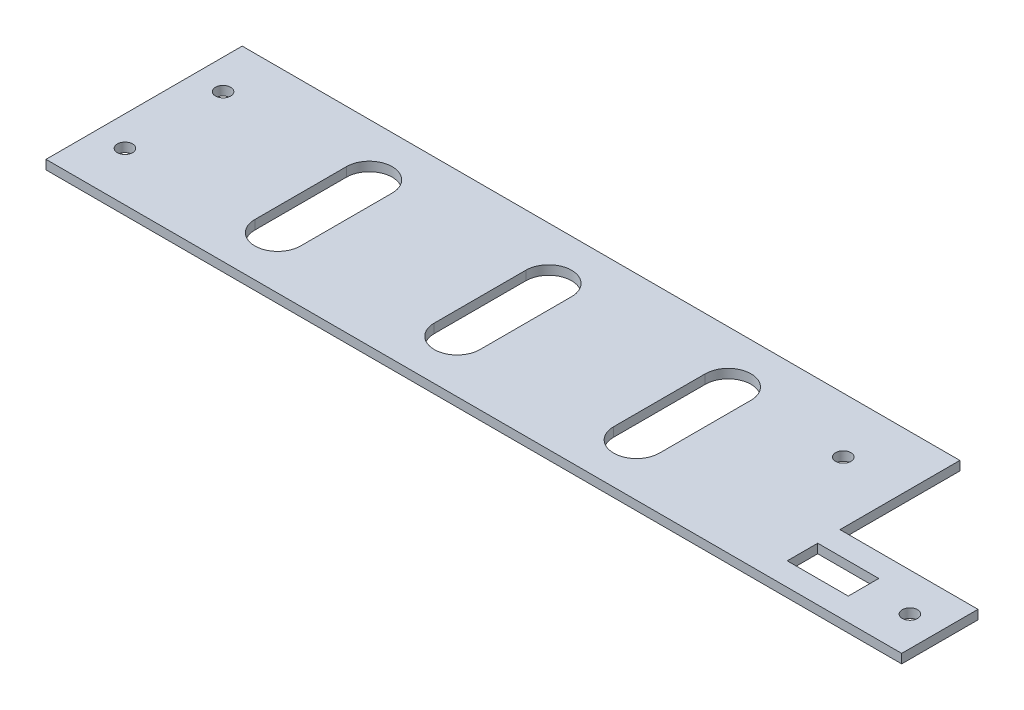
ISO-10303-21;
HEADER;
FILE_DESCRIPTION(('STEP AP214'),'2;1');
FILE_NAME('part.step','',(''),(''),'','','');
FILE_SCHEMA(('AUTOMOTIVE_DESIGN { 1 0 10303 214 1 1 1 1 }'));
ENDSEC;
DATA;
#1=APPLICATION_CONTEXT('core data for automotive mechanical design processes');
#2=APPLICATION_PROTOCOL_DEFINITION('international standard','automotive_design',2000,#1);
#3=PRODUCT_CONTEXT('',#1,'mechanical');
#4=PRODUCT('Part','Part','',(#3));
#5=PRODUCT_RELATED_PRODUCT_CATEGORY('part','',(#4));
#6=PRODUCT_DEFINITION_FORMATION('','',#4);
#7=PRODUCT_DEFINITION_CONTEXT('part definition',#1,'design');
#8=PRODUCT_DEFINITION('design','',#6,#7);
#9=PRODUCT_DEFINITION_SHAPE('','',#8);
#10=(LENGTH_UNIT() NAMED_UNIT(*) SI_UNIT(.MILLI.,.METRE.));
#11=(NAMED_UNIT(*) PLANE_ANGLE_UNIT() SI_UNIT($,.RADIAN.));
#12=(NAMED_UNIT(*) SI_UNIT($,.STERADIAN.) SOLID_ANGLE_UNIT());
#13=UNCERTAINTY_MEASURE_WITH_UNIT(LENGTH_MEASURE(1.E-05),#10,'distance_accuracy_value','');
#14=(GEOMETRIC_REPRESENTATION_CONTEXT(3) GLOBAL_UNCERTAINTY_ASSIGNED_CONTEXT((#13)) GLOBAL_UNIT_ASSIGNED_CONTEXT((#10,
#11,#12)) REPRESENTATION_CONTEXT('',''));
#15=CARTESIAN_POINT('',(0.,0.,0.));
#16=DIRECTION('',(0.,0.,1.));
#17=DIRECTION('',(1.,0.,0.));
#18=AXIS2_PLACEMENT_3D('',#15,#16,#17);
#19=CARTESIAN_POINT('',(0.,3.,0.));
#20=DIRECTION('',(0.,-1.,0.));
#21=DIRECTION('',(0.,0.,-1.));
#22=AXIS2_PLACEMENT_3D('',#19,#20,#21);
#23=PLANE('',#22);
#24=DIRECTION('',(0.,0.,1.));
#25=VECTOR('',#24,1.);
#26=CARTESIAN_POINT('',(-118.75689554249,3.,-11.6350000001407));
#27=LINE('',#26,#25);
#28=CARTESIAN_POINT('',(-118.75689554249,3.,-11.6350000001407));
#29=VERTEX_POINT('',#28);
#30=CARTESIAN_POINT('',(-118.75689554249,3.,18.3649999998593));
#31=VERTEX_POINT('',#30);
#32=EDGE_CURVE('E220',#29,#31,#27,.T.);
#33=ORIENTED_EDGE('',*,*,#32,.F.);
#34=CARTESIAN_POINT('',(-111.25689554249,3.,-11.6350000001407));
#35=DIRECTION('',(0.,1.,0.));
#36=DIRECTION('',(0.,0.,1.));
#37=AXIS2_PLACEMENT_3D('',#34,#35,#36);
#38=CIRCLE('',#37,7.49999999999999);
#39=CARTESIAN_POINT('',(-103.75689554249,3.,-11.6350000001407));
#40=VERTEX_POINT('',#39);
#41=EDGE_CURVE('E53',#40,#29,#38,.T.);
#42=ORIENTED_EDGE('',*,*,#41,.F.);
#43=DIRECTION('',(0.,0.,-1.));
#44=VECTOR('',#43,1.);
#45=CARTESIAN_POINT('',(-103.75689554249,3.,18.3649999998593));
#46=LINE('',#45,#44);
#47=CARTESIAN_POINT('',(-103.75689554249,3.,18.3649999998593));
#48=VERTEX_POINT('',#47);
#49=EDGE_CURVE('E210',#48,#40,#46,.T.);
#50=ORIENTED_EDGE('',*,*,#49,.F.);
#51=CARTESIAN_POINT('',(-111.25689554249,3.,18.3649999998593));
#52=DIRECTION('',(0.,1.,0.));
#53=DIRECTION('',(0.,0.,-1.));
#54=AXIS2_PLACEMENT_3D('',#51,#52,#53);
#55=CIRCLE('',#54,7.49999999999999);
#56=EDGE_CURVE('E213',#31,#48,#55,.T.);
#57=ORIENTED_EDGE('',*,*,#56,.F.);
#58=EDGE_LOOP('',(#33,#42,#50,#57));
#59=FACE_BOUND('',#58,.T.);
#60=DIRECTION('',(0.,0.,1.));
#61=VECTOR('',#60,1.);
#62=CARTESIAN_POINT('',(-59.9853346899049,3.,-11.6350000001407));
#63=LINE('',#62,#61);
#64=CARTESIAN_POINT('',(-59.9853346899049,3.,-11.6350000001407));
#65=VERTEX_POINT('',#64);
#66=CARTESIAN_POINT('',(-59.985334689905,3.,18.3649999998593));
#67=VERTEX_POINT('',#66);
#68=EDGE_CURVE('E247',#65,#67,#63,.T.);
#69=ORIENTED_EDGE('',*,*,#68,.F.);
#70=CARTESIAN_POINT('',(-52.485334689905,3.,-11.6350000001407));
#71=DIRECTION('',(0.,1.,0.));
#72=DIRECTION('',(0.,0.,1.));
#73=AXIS2_PLACEMENT_3D('',#70,#71,#72);
#74=CIRCLE('',#73,7.49999999999999);
#75=CARTESIAN_POINT('',(-44.9853346899049,3.,-11.6350000001407));
#76=VERTEX_POINT('',#75);
#77=EDGE_CURVE('E61',#76,#65,#74,.T.);
#78=ORIENTED_EDGE('',*,*,#77,.F.);
#79=DIRECTION('',(0.,0.,-1.));
#80=VECTOR('',#79,1.);
#81=CARTESIAN_POINT('',(-44.9853346899049,3.,18.3649999998593));
#82=LINE('',#81,#80);
#83=CARTESIAN_POINT('',(-44.9853346899049,3.,18.3649999998593));
#84=VERTEX_POINT('',#83);
#85=EDGE_CURVE('E236',#84,#76,#82,.T.);
#86=ORIENTED_EDGE('',*,*,#85,.F.);
#87=CARTESIAN_POINT('',(-52.485334689905,3.,18.3649999998593));
#88=DIRECTION('',(0.,1.,0.));
#89=DIRECTION('',(0.,0.,-1.));
#90=AXIS2_PLACEMENT_3D('',#87,#88,#89);
#91=CIRCLE('',#90,7.49999999999999);
#92=EDGE_CURVE('E251',#67,#84,#91,.T.);
#93=ORIENTED_EDGE('',*,*,#92,.F.);
#94=EDGE_LOOP('',(#69,#78,#86,#93));
#95=FACE_BOUND('',#94,.T.);
#96=DIRECTION('',(0.,0.,1.));
#97=VECTOR('',#96,1.);
#98=CARTESIAN_POINT('',(-1.21377383732015,3.,-11.635000000085));
#99=LINE('',#98,#97);
#100=CARTESIAN_POINT('',(-1.21377383732015,3.,-11.635000000085));
#101=VERTEX_POINT('',#100);
#102=CARTESIAN_POINT('',(-1.21377383732015,3.,18.364999999915));
#103=VERTEX_POINT('',#102);
#104=EDGE_CURVE('E278',#101,#103,#99,.T.);
#105=ORIENTED_EDGE('',*,*,#104,.F.);
#106=CARTESIAN_POINT('',(6.28622616267984,3.,-11.635000000085));
#107=DIRECTION('',(0.,1.,0.));
#108=DIRECTION('',(0.,0.,1.));
#109=AXIS2_PLACEMENT_3D('',#106,#107,#108);
#110=CIRCLE('',#109,7.49999999999999);
#111=CARTESIAN_POINT('',(13.7862261626798,3.,-11.635000000085));
#112=VERTEX_POINT('',#111);
#113=EDGE_CURVE('E276',#112,#101,#110,.T.);
#114=ORIENTED_EDGE('',*,*,#113,.F.);
#115=DIRECTION('',(0.,0.,-1.));
#116=VECTOR('',#115,1.);
#117=CARTESIAN_POINT('',(13.7862261626798,3.,18.364999999915));
#118=LINE('',#117,#116);
#119=CARTESIAN_POINT('',(13.7862261626798,3.,18.364999999915));
#120=VERTEX_POINT('',#119);
#121=EDGE_CURVE('E266',#120,#112,#118,.T.);
#122=ORIENTED_EDGE('',*,*,#121,.F.);
#123=CARTESIAN_POINT('',(6.28622616267984,3.,18.3649999998037));
#124=DIRECTION('',(0.,1.,0.));
#125=DIRECTION('',(0.,0.,-1.));
#126=AXIS2_PLACEMENT_3D('',#123,#124,#125);
#127=CIRCLE('',#126,7.49999999999999);
#128=EDGE_CURVE('E282',#103,#120,#127,.T.);
#129=ORIENTED_EDGE('',*,*,#128,.F.);
#130=EDGE_LOOP('',(#105,#114,#122,#129));
#131=FACE_BOUND('',#130,.T.);
#132=DIRECTION('',(-1.,0.,0.));
#133=VECTOR('',#132,1.);
#134=CARTESIAN_POINT('',(85.2715436048932,3.,17.999999999835));
#135=LINE('',#134,#133);
#136=CARTESIAN_POINT('',(85.2715436048932,3.,17.999999999835));
#137=VERTEX_POINT('',#136);
#138=CARTESIAN_POINT('',(65.2715436048932,3.,17.999999999835));
#139=VERTEX_POINT('',#138);
#140=EDGE_CURVE('E310',#137,#139,#135,.T.);
#141=ORIENTED_EDGE('',*,*,#140,.F.);
#142=DIRECTION('',(0.,0.,-1.));
#143=VECTOR('',#142,1.);
#144=CARTESIAN_POINT('',(85.2715436048932,3.,27.999999999835));
#145=LINE('',#144,#143);
#146=CARTESIAN_POINT('',(85.2715436048932,3.,27.999999999835));
#147=VERTEX_POINT('',#146);
#148=EDGE_CURVE('E308',#147,#137,#145,.T.);
#149=ORIENTED_EDGE('',*,*,#148,.F.);
#150=DIRECTION('',(1.,0.,0.));
#151=VECTOR('',#150,1.);
#152=CARTESIAN_POINT('',(65.2715436048932,3.,27.999999999835));
#153=LINE('',#152,#151);
#154=CARTESIAN_POINT('',(65.2715436048932,3.,27.999999999835));
#155=VERTEX_POINT('',#154);
#156=EDGE_CURVE('E298',#155,#147,#153,.T.);
#157=ORIENTED_EDGE('',*,*,#156,.F.);
#158=DIRECTION('',(0.,0.,1.));
#159=VECTOR('',#158,1.);
#160=CARTESIAN_POINT('',(65.2715436048932,3.,17.999999999835));
#161=LINE('',#160,#159);
#162=EDGE_CURVE('E313',#139,#155,#161,.T.);
#163=ORIENTED_EDGE('',*,*,#162,.F.);
#164=EDGE_LOOP('',(#141,#149,#157,#163));
#165=FACE_BOUND('',#164,.T.);
#166=DIRECTION('',(-1.,0.,-3.51525277488647E-13));
#167=VECTOR('',#166,1.);
#168=CARTESIAN_POINT('',(-170.028456395074,3.,-28.7700000001166));
#169=LINE('',#168,#167);
#170=CARTESIAN_POINT('',(65.0577870152646,3.,-28.770000000034));
#171=VERTEX_POINT('',#170);
#172=CARTESIAN_POINT('',(-170.028456395074,3.,-28.7700000001166));
#173=VERTEX_POINT('',#172);
#174=EDGE_CURVE('E349',#171,#173,#169,.T.);
#175=ORIENTED_EDGE('',*,*,#174,.T.);
#176=DIRECTION('',(0.,0.,1.));
#177=VECTOR('',#176,1.);
#178=CARTESIAN_POINT('',(-170.028456395074,3.,-28.7700000001166));
#179=LINE('',#178,#177);
#180=CARTESIAN_POINT('',(-170.028456395074,3.,35.4999999998353));
#181=VERTEX_POINT('',#180);
#182=EDGE_CURVE('E352',#173,#181,#179,.T.);
#183=ORIENTED_EDGE('',*,*,#182,.T.);
#184=DIRECTION('',(1.,0.,0.));
#185=VECTOR('',#184,1.);
#186=CARTESIAN_POINT('',(-170.028456395074,3.,35.4999999998353));
#187=LINE('',#186,#185);
#188=CARTESIAN_POINT('',(110.271543604893,3.,35.4999999998353));
#189=VERTEX_POINT('',#188);
#190=EDGE_CURVE('E356',#181,#189,#187,.T.);
#191=ORIENTED_EDGE('',*,*,#190,.T.);
#192=DIRECTION('',(0.,0.,-1.));
#193=VECTOR('',#192,1.);
#194=CARTESIAN_POINT('',(110.271543604893,3.,10.4999999998353));
#195=LINE('',#194,#193);
#196=CARTESIAN_POINT('',(110.271543604893,3.,10.4999999998353));
#197=VERTEX_POINT('',#196);
#198=EDGE_CURVE('E359',#189,#197,#195,.T.);
#199=ORIENTED_EDGE('',*,*,#198,.T.);
#200=DIRECTION('',(-1.,0.,2.89618351105165E-12));
#201=VECTOR('',#200,1.);
#202=CARTESIAN_POINT('',(65.0577870152646,3.,10.4999999999663));
#203=LINE('',#202,#201);
#204=CARTESIAN_POINT('',(65.0577870152646,3.,10.4999999999663));
#205=VERTEX_POINT('',#204);
#206=EDGE_CURVE('E361',#197,#205,#203,.T.);
#207=ORIENTED_EDGE('',*,*,#206,.T.);
#208=DIRECTION('',(0.,0.,-1.));
#209=VECTOR('',#208,1.);
#210=CARTESIAN_POINT('',(65.0577870152646,3.,-28.770000000034));
#211=LINE('',#210,#209);
#212=EDGE_CURVE('E363',#205,#171,#211,.T.);
#213=ORIENTED_EDGE('',*,*,#212,.T.);
#214=EDGE_LOOP('',(#175,#183,#191,#199,#207,#213));
#215=FACE_BOUND('',#214,.T.);
#216=CARTESIAN_POINT('',(45.0077870153472,3.,-10.6350000001093));
#217=DIRECTION('',(0.,1.,0.));
#218=DIRECTION('',(0.,0.,1.));
#219=AXIS2_PLACEMENT_3D('',#216,#217,#218);
#220=CIRCLE('',#219,2.5);
#221=CARTESIAN_POINT('',(45.0077870153472,3.,-8.13500000010927));
#222=VERTEX_POINT('',#221);
#223=EDGE_CURVE('E343',#222,#222,#220,.T.);
#224=ORIENTED_EDGE('',*,*,#223,.F.);
#225=EDGE_LOOP('',(#224));
#226=FACE_BOUND('',#225,.T.);
#227=CARTESIAN_POINT('',(-160.228456395074,3.,19.432499999835));
#228=DIRECTION('',(0.,1.,0.));
#229=DIRECTION('',(0.,0.,1.));
#230=AXIS2_PLACEMENT_3D('',#227,#228,#229);
#231=CIRCLE('',#230,2.5);
#232=CARTESIAN_POINT('',(-160.228456395074,3.,21.932499999835));
#233=VERTEX_POINT('',#232);
#234=EDGE_CURVE('E337',#233,#233,#231,.T.);
#235=ORIENTED_EDGE('',*,*,#234,.F.);
#236=EDGE_LOOP('',(#235));
#237=FACE_BOUND('',#236,.T.);
#238=CARTESIAN_POINT('',(100.471543604893,3.,22.999999999835));
#239=DIRECTION('',(0.,1.,0.));
#240=DIRECTION('',(0.,0.,1.));
#241=AXIS2_PLACEMENT_3D('',#238,#239,#240);
#242=CIRCLE('',#241,2.50000000000001);
#243=CARTESIAN_POINT('',(100.471543604893,3.,25.499999999835));
#244=VERTEX_POINT('',#243);
#245=EDGE_CURVE('E331',#244,#244,#242,.T.);
#246=ORIENTED_EDGE('',*,*,#245,.F.);
#247=EDGE_LOOP('',(#246));
#248=FACE_BOUND('',#247,.T.);
#249=CARTESIAN_POINT('',(-160.228456395074,3.,-12.702500000165));
#250=DIRECTION('',(0.,1.,0.));
#251=DIRECTION('',(0.,0.,1.));
#252=AXIS2_PLACEMENT_3D('',#249,#250,#251);
#253=CIRCLE('',#252,2.5);
#254=CARTESIAN_POINT('',(-160.228456395074,3.,-10.202500000165));
#255=VERTEX_POINT('',#254);
#256=EDGE_CURVE('E325',#255,#255,#253,.T.);
#257=ORIENTED_EDGE('',*,*,#256,.F.);
#258=EDGE_LOOP('',(#257));
#259=FACE_BOUND('',#258,.T.);
#260=ADVANCED_FACE('F38',(#59,#95,#131,#165,#215,#226,#237,#248,#259),#23,.F.);
#261=CARTESIAN_POINT('',(0.,0.,0.));
#262=DIRECTION('',(0.,-1.,0.));
#263=DIRECTION('',(0.,0.,-1.));
#264=AXIS2_PLACEMENT_3D('',#261,#262,#263);
#265=PLANE('',#264);
#266=CARTESIAN_POINT('',(-111.25689554249,0.,-11.6350000001407));
#267=DIRECTION('',(0.,1.,0.));
#268=DIRECTION('',(0.,0.,1.));
#269=AXIS2_PLACEMENT_3D('',#266,#267,#268);
#270=CIRCLE('',#269,7.49999999999999);
#271=CARTESIAN_POINT('',(-103.75689554249,0.,-11.6350000001407));
#272=VERTEX_POINT('',#271);
#273=CARTESIAN_POINT('',(-118.75689554249,0.,-11.6350000001407));
#274=VERTEX_POINT('',#273);
#275=EDGE_CURVE('E191',#272,#274,#270,.T.);
#276=ORIENTED_EDGE('',*,*,#275,.T.);
#277=DIRECTION('',(0.,0.,1.));
#278=VECTOR('',#277,1.);
#279=CARTESIAN_POINT('',(-118.75689554249,0.,-11.6350000001407));
#280=LINE('',#279,#278);
#281=CARTESIAN_POINT('',(-118.75689554249,0.,18.3649999998593));
#282=VERTEX_POINT('',#281);
#283=EDGE_CURVE('E201',#274,#282,#280,.T.);
#284=ORIENTED_EDGE('',*,*,#283,.T.);
#285=CARTESIAN_POINT('',(-111.25689554249,0.,18.3649999998593));
#286=DIRECTION('',(0.,1.,0.));
#287=DIRECTION('',(0.,0.,-1.));
#288=AXIS2_PLACEMENT_3D('',#285,#286,#287);
#289=CIRCLE('',#288,7.49999999999999);
#290=CARTESIAN_POINT('',(-103.75689554249,0.,18.3649999998593));
#291=VERTEX_POINT('',#290);
#292=EDGE_CURVE('E205',#282,#291,#289,.T.);
#293=ORIENTED_EDGE('',*,*,#292,.T.);
#294=DIRECTION('',(0.,0.,-1.));
#295=VECTOR('',#294,1.);
#296=CARTESIAN_POINT('',(-103.75689554249,0.,18.3649999998593));
#297=LINE('',#296,#295);
#298=EDGE_CURVE('E197',#291,#272,#297,.T.);
#299=ORIENTED_EDGE('',*,*,#298,.T.);
#300=EDGE_LOOP('',(#276,#284,#293,#299));
#301=FACE_BOUND('',#300,.T.);
#302=CARTESIAN_POINT('',(-52.485334689905,0.,-11.6350000001407));
#303=DIRECTION('',(0.,1.,0.));
#304=DIRECTION('',(0.,0.,1.));
#305=AXIS2_PLACEMENT_3D('',#302,#303,#304);
#306=CIRCLE('',#305,7.49999999999999);
#307=CARTESIAN_POINT('',(-44.9853346899049,0.,-11.6350000001407));
#308=VERTEX_POINT('',#307);
#309=CARTESIAN_POINT('',(-59.9853346899049,0.,-11.6350000001407));
#310=VERTEX_POINT('',#309);
#311=EDGE_CURVE('E232',#308,#310,#306,.T.);
#312=ORIENTED_EDGE('',*,*,#311,.T.);
#313=DIRECTION('',(0.,0.,1.));
#314=VECTOR('',#313,1.);
#315=CARTESIAN_POINT('',(-59.9853346899049,0.,-11.6350000001407));
#316=LINE('',#315,#314);
#317=CARTESIAN_POINT('',(-59.9853346899049,0.,18.3649999998593));
#318=VERTEX_POINT('',#317);
#319=EDGE_CURVE('E235',#310,#318,#316,.T.);
#320=ORIENTED_EDGE('',*,*,#319,.T.);
#321=CARTESIAN_POINT('',(-52.485334689905,0.,18.3649999998593));
#322=DIRECTION('',(0.,1.,0.));
#323=DIRECTION('',(0.,0.,-1.));
#324=AXIS2_PLACEMENT_3D('',#321,#322,#323);
#325=CIRCLE('',#324,7.49999999999999);
#326=CARTESIAN_POINT('',(-44.9853346899049,0.,18.3649999998593));
#327=VERTEX_POINT('',#326);
#328=EDGE_CURVE('E239',#318,#327,#325,.T.);
#329=ORIENTED_EDGE('',*,*,#328,.T.);
#330=DIRECTION('',(0.,0.,-1.));
#331=VECTOR('',#330,1.);
#332=CARTESIAN_POINT('',(-44.9853346899049,0.,18.3649999998593));
#333=LINE('',#332,#331);
#334=EDGE_CURVE('E242',#327,#308,#333,.T.);
#335=ORIENTED_EDGE('',*,*,#334,.T.);
#336=EDGE_LOOP('',(#312,#320,#329,#335));
#337=FACE_BOUND('',#336,.T.);
#338=CARTESIAN_POINT('',(6.28622616267984,0.,-11.635000000085));
#339=DIRECTION('',(0.,1.,0.));
#340=DIRECTION('',(0.,0.,1.));
#341=AXIS2_PLACEMENT_3D('',#338,#339,#340);
#342=CIRCLE('',#341,7.49999999999999);
#343=CARTESIAN_POINT('',(13.7862261626798,0.,-11.635000000085));
#344=VERTEX_POINT('',#343);
#345=CARTESIAN_POINT('',(-1.21377383732015,0.,-11.635000000085));
#346=VERTEX_POINT('',#345);
#347=EDGE_CURVE('E262',#344,#346,#342,.T.);
#348=ORIENTED_EDGE('',*,*,#347,.T.);
#349=DIRECTION('',(0.,0.,1.));
#350=VECTOR('',#349,1.);
#351=CARTESIAN_POINT('',(-1.21377383732015,0.,-11.635000000085));
#352=LINE('',#351,#350);
#353=CARTESIAN_POINT('',(-1.21377383732015,0.,18.364999999915));
#354=VERTEX_POINT('',#353);
#355=EDGE_CURVE('E265',#346,#354,#352,.T.);
#356=ORIENTED_EDGE('',*,*,#355,.T.);
#357=CARTESIAN_POINT('',(6.28622616267984,0.,18.3649999998037));
#358=DIRECTION('',(0.,1.,0.));
#359=DIRECTION('',(0.,0.,-1.));
#360=AXIS2_PLACEMENT_3D('',#357,#358,#359);
#361=CIRCLE('',#360,7.49999999999999);
#362=CARTESIAN_POINT('',(13.7862261626798,0.,18.364999999915));
#363=VERTEX_POINT('',#362);
#364=EDGE_CURVE('E269',#354,#363,#361,.T.);
#365=ORIENTED_EDGE('',*,*,#364,.T.);
#366=DIRECTION('',(0.,0.,-1.));
#367=VECTOR('',#366,1.);
#368=CARTESIAN_POINT('',(13.7862261626798,0.,18.364999999915));
#369=LINE('',#368,#367);
#370=EDGE_CURVE('E272',#363,#344,#369,.T.);
#371=ORIENTED_EDGE('',*,*,#370,.T.);
#372=EDGE_LOOP('',(#348,#356,#365,#371));
#373=FACE_BOUND('',#372,.T.);
#374=DIRECTION('',(0.,0.,-1.));
#375=VECTOR('',#374,1.);
#376=CARTESIAN_POINT('',(85.2715436048932,0.,27.999999999835));
#377=LINE('',#376,#375);
#378=CARTESIAN_POINT('',(85.2715436048932,0.,27.999999999835));
#379=VERTEX_POINT('',#378);
#380=CARTESIAN_POINT('',(85.2715436048932,0.,17.999999999835));
#381=VERTEX_POINT('',#380);
#382=EDGE_CURVE('E294',#379,#381,#377,.T.);
#383=ORIENTED_EDGE('',*,*,#382,.T.);
#384=DIRECTION('',(-1.,0.,0.));
#385=VECTOR('',#384,1.);
#386=CARTESIAN_POINT('',(85.2715436048932,0.,17.999999999835));
#387=LINE('',#386,#385);
#388=CARTESIAN_POINT('',(65.2715436048932,0.,17.999999999835));
#389=VERTEX_POINT('',#388);
#390=EDGE_CURVE('E297',#381,#389,#387,.T.);
#391=ORIENTED_EDGE('',*,*,#390,.T.);
#392=DIRECTION('',(0.,0.,1.));
#393=VECTOR('',#392,1.);
#394=CARTESIAN_POINT('',(65.2715436048932,0.,17.999999999835));
#395=LINE('',#394,#393);
#396=CARTESIAN_POINT('',(65.2715436048932,0.,27.999999999835));
#397=VERTEX_POINT('',#396);
#398=EDGE_CURVE('E301',#389,#397,#395,.T.);
#399=ORIENTED_EDGE('',*,*,#398,.T.);
#400=DIRECTION('',(1.,0.,0.));
#401=VECTOR('',#400,1.);
#402=CARTESIAN_POINT('',(65.2715436048932,0.,27.999999999835));
#403=LINE('',#402,#401);
#404=EDGE_CURVE('E304',#397,#379,#403,.T.);
#405=ORIENTED_EDGE('',*,*,#404,.T.);
#406=EDGE_LOOP('',(#383,#391,#399,#405));
#407=FACE_BOUND('',#406,.T.);
#408=CARTESIAN_POINT('',(100.471543604893,0.,22.999999999835));
#409=DIRECTION('',(0.,1.,0.));
#410=DIRECTION('',(0.,0.,1.));
#411=AXIS2_PLACEMENT_3D('',#408,#409,#410);
#412=CIRCLE('',#411,2.50000000000001);
#413=CARTESIAN_POINT('',(100.471543604893,0.,25.499999999835));
#414=VERTEX_POINT('',#413);
#415=EDGE_CURVE('E328',#414,#414,#412,.T.);
#416=ORIENTED_EDGE('',*,*,#415,.T.);
#417=EDGE_LOOP('',(#416));
#418=FACE_BOUND('',#417,.T.);
#419=CARTESIAN_POINT('',(45.0077870153472,0.,-10.6350000001093));
#420=DIRECTION('',(0.,1.,0.));
#421=DIRECTION('',(0.,0.,1.));
#422=AXIS2_PLACEMENT_3D('',#419,#420,#421);
#423=CIRCLE('',#422,2.5);
#424=CARTESIAN_POINT('',(45.0077870153472,0.,-8.13500000010927));
#425=VERTEX_POINT('',#424);
#426=EDGE_CURVE('E340',#425,#425,#423,.T.);
#427=ORIENTED_EDGE('',*,*,#426,.T.);
#428=EDGE_LOOP('',(#427));
#429=FACE_BOUND('',#428,.T.);
#430=DIRECTION('',(-1.,0.,-3.51525277488647E-13));
#431=VECTOR('',#430,1.);
#432=CARTESIAN_POINT('',(-170.028456395074,0.,-28.7700000001166));
#433=LINE('',#432,#431);
#434=CARTESIAN_POINT('',(65.0577870152646,0.,-28.770000000034));
#435=VERTEX_POINT('',#434);
#436=CARTESIAN_POINT('',(-170.028456395074,0.,-28.7700000001166));
#437=VERTEX_POINT('',#436);
#438=EDGE_CURVE('E346',#435,#437,#433,.T.);
#439=ORIENTED_EDGE('',*,*,#438,.F.);
#440=DIRECTION('',(0.,0.,-1.));
#441=VECTOR('',#440,1.);
#442=CARTESIAN_POINT('',(65.0577870152646,0.,-28.770000000034));
#443=LINE('',#442,#441);
#444=CARTESIAN_POINT('',(65.0577870152646,0.,10.4999999999663));
#445=VERTEX_POINT('',#444);
#446=EDGE_CURVE('E353',#445,#435,#443,.T.);
#447=ORIENTED_EDGE('',*,*,#446,.F.);
#448=DIRECTION('',(-1.,0.,2.89618351105165E-12));
#449=VECTOR('',#448,1.);
#450=CARTESIAN_POINT('',(65.0577870152646,0.,10.4999999999663));
#451=LINE('',#450,#449);
#452=CARTESIAN_POINT('',(110.271543604893,0.,10.4999999998353));
#453=VERTEX_POINT('',#452);
#454=EDGE_CURVE('E376',#453,#445,#451,.T.);
#455=ORIENTED_EDGE('',*,*,#454,.F.);
#456=DIRECTION('',(0.,0.,-1.));
#457=VECTOR('',#456,1.);
#458=CARTESIAN_POINT('',(110.271543604893,0.,10.4999999998353));
#459=LINE('',#458,#457);
#460=CARTESIAN_POINT('',(110.271543604893,0.,35.4999999998353));
#461=VERTEX_POINT('',#460);
#462=EDGE_CURVE('E374',#461,#453,#459,.T.);
#463=ORIENTED_EDGE('',*,*,#462,.F.);
#464=DIRECTION('',(1.,0.,0.));
#465=VECTOR('',#464,1.);
#466=CARTESIAN_POINT('',(-170.028456395074,0.,35.4999999998353));
#467=LINE('',#466,#465);
#468=CARTESIAN_POINT('',(-170.028456395074,0.,35.4999999998353));
#469=VERTEX_POINT('',#468);
#470=EDGE_CURVE('E371',#469,#461,#467,.T.);
#471=ORIENTED_EDGE('',*,*,#470,.F.);
#472=DIRECTION('',(0.,0.,1.));
#473=VECTOR('',#472,1.);
#474=CARTESIAN_POINT('',(-170.028456395074,0.,22.9999999998351));
#475=LINE('',#474,#473);
#476=EDGE_CURVE('E368',#437,#469,#475,.T.);
#477=ORIENTED_EDGE('',*,*,#476,.F.);
#478=EDGE_LOOP('',(#439,#447,#455,#463,#471,#477));
#479=FACE_BOUND('',#478,.T.);
#480=CARTESIAN_POINT('',(-160.228456395074,0.,19.432499999835));
#481=DIRECTION('',(0.,1.,0.));
#482=DIRECTION('',(0.,0.,1.));
#483=AXIS2_PLACEMENT_3D('',#480,#481,#482);
#484=CIRCLE('',#483,2.5);
#485=CARTESIAN_POINT('',(-160.228456395074,0.,21.932499999835));
#486=VERTEX_POINT('',#485);
#487=EDGE_CURVE('E334',#486,#486,#484,.T.);
#488=ORIENTED_EDGE('',*,*,#487,.T.);
#489=EDGE_LOOP('',(#488));
#490=FACE_BOUND('',#489,.T.);
#491=CARTESIAN_POINT('',(-160.228456395074,0.,-12.702500000165));
#492=DIRECTION('',(0.,1.,0.));
#493=DIRECTION('',(0.,0.,1.));
#494=AXIS2_PLACEMENT_3D('',#491,#492,#493);
#495=CIRCLE('',#494,2.5);
#496=CARTESIAN_POINT('',(-160.228456395074,0.,-10.202500000165));
#497=VERTEX_POINT('',#496);
#498=EDGE_CURVE('E228',#497,#497,#495,.T.);
#499=ORIENTED_EDGE('',*,*,#498,.T.);
#500=EDGE_LOOP('',(#499));
#501=FACE_BOUND('',#500,.T.);
#502=ADVANCED_FACE('F207',(#301,#337,#373,#407,#418,#429,#479,#490,#501),#265,.T.);
#503=CARTESIAN_POINT('',(-170.028456395074,3.,-28.7700000001166));
#504=DIRECTION('',(-3.51525277488647E-13,0.,1.));
#505=DIRECTION('',(1.,0.,3.51525277488647E-13));
#506=AXIS2_PLACEMENT_3D('',#503,#504,#505);
#507=PLANE('',#506);
#508=ORIENTED_EDGE('',*,*,#438,.T.);
#509=DIRECTION('',(0.,-1.,0.));
#510=VECTOR('',#509,1.);
#511=CARTESIAN_POINT('',(-170.028456395074,3.,-28.7700000001166));
#512=LINE('',#511,#510);
#513=EDGE_CURVE('E11',#173,#437,#512,.T.);
#514=ORIENTED_EDGE('',*,*,#513,.F.);
#515=ORIENTED_EDGE('',*,*,#174,.F.);
#516=DIRECTION('',(0.,-1.,0.));
#517=VECTOR('',#516,1.);
#518=CARTESIAN_POINT('',(65.0577870152646,3.,-28.770000000034));
#519=LINE('',#518,#517);
#520=EDGE_CURVE('E365',#171,#435,#519,.T.);
#521=ORIENTED_EDGE('',*,*,#520,.T.);
#522=EDGE_LOOP('',(#508,#514,#515,#521));
#523=FACE_BOUND('',#522,.T.);
#524=ADVANCED_FACE('F40',(#523),#507,.F.);
#525=CARTESIAN_POINT('',(-170.028456395074,3.,22.9999999998351));
#526=DIRECTION('',(1.,0.,0.));
#527=DIRECTION('',(0.,0.,-1.));
#528=AXIS2_PLACEMENT_3D('',#525,#526,#527);
#529=PLANE('',#528);
#530=ORIENTED_EDGE('',*,*,#476,.T.);
#531=DIRECTION('',(0.,-1.,0.));
#532=VECTOR('',#531,1.);
#533=CARTESIAN_POINT('',(-170.028456395074,3.,35.4999999998353));
#534=LINE('',#533,#532);
#535=EDGE_CURVE('E46',#181,#469,#534,.T.);
#536=ORIENTED_EDGE('',*,*,#535,.F.);
#537=ORIENTED_EDGE('',*,*,#182,.F.);
#538=ORIENTED_EDGE('',*,*,#513,.T.);
#539=EDGE_LOOP('',(#530,#536,#537,#538));
#540=FACE_BOUND('',#539,.T.);
#541=ADVANCED_FACE('F418',(#540),#529,.F.);
#542=CARTESIAN_POINT('',(-170.028456395074,3.,35.4999999998353));
#543=DIRECTION('',(0.,0.,-1.));
#544=DIRECTION('',(-1.,0.,0.));
#545=AXIS2_PLACEMENT_3D('',#542,#543,#544);
#546=PLANE('',#545);
#547=ORIENTED_EDGE('',*,*,#470,.T.);
#548=DIRECTION('',(0.,-1.,0.));
#549=VECTOR('',#548,1.);
#550=CARTESIAN_POINT('',(110.271543604893,3.,35.4999999998353));
#551=LINE('',#550,#549);
#552=EDGE_CURVE('E387',#189,#461,#551,.T.);
#553=ORIENTED_EDGE('',*,*,#552,.F.);
#554=ORIENTED_EDGE('',*,*,#190,.F.);
#555=ORIENTED_EDGE('',*,*,#535,.T.);
#556=EDGE_LOOP('',(#547,#553,#554,#555));
#557=FACE_BOUND('',#556,.T.);
#558=ADVANCED_FACE('F395',(#557),#546,.F.);
#559=CARTESIAN_POINT('',(110.271543604893,3.,10.4999999998353));
#560=DIRECTION('',(-1.,0.,0.));
#561=DIRECTION('',(0.,0.,1.));
#562=AXIS2_PLACEMENT_3D('',#559,#560,#561);
#563=PLANE('',#562);
#564=ORIENTED_EDGE('',*,*,#462,.T.);
#565=DIRECTION('',(0.,-1.,0.));
#566=VECTOR('',#565,1.);
#567=CARTESIAN_POINT('',(110.271543604893,3.,10.4999999998353));
#568=LINE('',#567,#566);
#569=EDGE_CURVE('E384',#197,#453,#568,.T.);
#570=ORIENTED_EDGE('',*,*,#569,.F.);
#571=ORIENTED_EDGE('',*,*,#198,.F.);
#572=ORIENTED_EDGE('',*,*,#552,.T.);
#573=EDGE_LOOP('',(#564,#570,#571,#572));
#574=FACE_BOUND('',#573,.T.);
#575=ADVANCED_FACE('F406',(#574),#563,.F.);
#576=CARTESIAN_POINT('',(65.0577870152646,3.,10.4999999999663));
#577=DIRECTION('',(2.89618351105165E-12,0.,1.));
#578=DIRECTION('',(1.,0.,-2.89618351105165E-12));
#579=AXIS2_PLACEMENT_3D('',#576,#577,#578);
#580=PLANE('',#579);
#581=ORIENTED_EDGE('',*,*,#454,.T.);
#582=DIRECTION('',(0.,-1.,0.));
#583=VECTOR('',#582,1.);
#584=CARTESIAN_POINT('',(65.0577870152646,3.,10.4999999999663));
#585=LINE('',#584,#583);
#586=EDGE_CURVE('E381',#205,#445,#585,.T.);
#587=ORIENTED_EDGE('',*,*,#586,.F.);
#588=ORIENTED_EDGE('',*,*,#206,.F.);
#589=ORIENTED_EDGE('',*,*,#569,.T.);
#590=EDGE_LOOP('',(#581,#587,#588,#589));
#591=FACE_BOUND('',#590,.T.);
#592=ADVANCED_FACE('F410',(#591),#580,.F.);
#593=CARTESIAN_POINT('',(65.0577870152646,3.,-28.770000000034));
#594=DIRECTION('',(-1.,0.,0.));
#595=DIRECTION('',(0.,0.,1.));
#596=AXIS2_PLACEMENT_3D('',#593,#594,#595);
#597=PLANE('',#596);
#598=ORIENTED_EDGE('',*,*,#446,.T.);
#599=ORIENTED_EDGE('',*,*,#520,.F.);
#600=ORIENTED_EDGE('',*,*,#212,.F.);
#601=ORIENTED_EDGE('',*,*,#586,.T.);
#602=EDGE_LOOP('',(#598,#599,#600,#601));
#603=FACE_BOUND('',#602,.T.);
#604=ADVANCED_FACE('F421',(#603),#597,.F.);
#605=CARTESIAN_POINT('',(45.0077870153472,3.,-10.6350000001093));
#606=DIRECTION('',(0.,-1.,0.));
#607=DIRECTION('',(0.,0.,-1.));
#608=AXIS2_PLACEMENT_3D('',#605,#606,#607);
#609=CYLINDRICAL_SURFACE('',#608,2.5);
#610=ORIENTED_EDGE('',*,*,#223,.T.);
#611=EDGE_LOOP('',(#610));
#612=FACE_BOUND('',#611,.T.);
#613=ORIENTED_EDGE('',*,*,#426,.F.);
#614=EDGE_LOOP('',(#613));
#615=FACE_BOUND('',#614,.T.);
#616=ADVANCED_FACE('F423',(#612,#615),#609,.F.);
#617=CARTESIAN_POINT('',(-160.228456395074,3.,19.432499999835));
#618=DIRECTION('',(0.,-1.,0.));
#619=DIRECTION('',(0.,0.,-1.));
#620=AXIS2_PLACEMENT_3D('',#617,#618,#619);
#621=CYLINDRICAL_SURFACE('',#620,2.5);
#622=ORIENTED_EDGE('',*,*,#234,.T.);
#623=EDGE_LOOP('',(#622));
#624=FACE_BOUND('',#623,.T.);
#625=ORIENTED_EDGE('',*,*,#487,.F.);
#626=EDGE_LOOP('',(#625));
#627=FACE_BOUND('',#626,.T.);
#628=ADVANCED_FACE('F429',(#624,#627),#621,.F.);
#629=CARTESIAN_POINT('',(100.471543604893,3.,22.999999999835));
#630=DIRECTION('',(0.,-1.,0.));
#631=DIRECTION('',(0.,0.,-1.));
#632=AXIS2_PLACEMENT_3D('',#629,#630,#631);
#633=CYLINDRICAL_SURFACE('',#632,2.50000000000001);
#634=ORIENTED_EDGE('',*,*,#245,.T.);
#635=EDGE_LOOP('',(#634));
#636=FACE_BOUND('',#635,.T.);
#637=ORIENTED_EDGE('',*,*,#415,.F.);
#638=EDGE_LOOP('',(#637));
#639=FACE_BOUND('',#638,.T.);
#640=ADVANCED_FACE('F444',(#636,#639),#633,.F.);
#641=CARTESIAN_POINT('',(-160.228456395074,3.,-12.702500000165));
#642=DIRECTION('',(0.,-1.,0.));
#643=DIRECTION('',(0.,0.,-1.));
#644=AXIS2_PLACEMENT_3D('',#641,#642,#643);
#645=CYLINDRICAL_SURFACE('',#644,2.5);
#646=ORIENTED_EDGE('',*,*,#256,.T.);
#647=EDGE_LOOP('',(#646));
#648=FACE_BOUND('',#647,.T.);
#649=ORIENTED_EDGE('',*,*,#498,.F.);
#650=EDGE_LOOP('',(#649));
#651=FACE_BOUND('',#650,.T.);
#652=ADVANCED_FACE('F448',(#648,#651),#645,.F.);
#653=CARTESIAN_POINT('',(85.2715436048932,0.,27.999999999835));
#654=DIRECTION('',(1.,0.,0.));
#655=DIRECTION('',(0.,0.,-1.));
#656=AXIS2_PLACEMENT_3D('',#653,#654,#655);
#657=PLANE('',#656);
#658=ORIENTED_EDGE('',*,*,#148,.T.);
#659=DIRECTION('',(0.,1.,0.));
#660=VECTOR('',#659,1.);
#661=CARTESIAN_POINT('',(85.2715436048932,0.,17.999999999835));
#662=LINE('',#661,#660);
#663=EDGE_CURVE('E307',#381,#137,#662,.T.);
#664=ORIENTED_EDGE('',*,*,#663,.F.);
#665=ORIENTED_EDGE('',*,*,#382,.F.);
#666=DIRECTION('',(0.,1.,0.));
#667=VECTOR('',#666,1.);
#668=CARTESIAN_POINT('',(85.2715436048932,0.,27.999999999835));
#669=LINE('',#668,#667);
#670=EDGE_CURVE('E279',#379,#147,#669,.T.);
#671=ORIENTED_EDGE('',*,*,#670,.T.);
#672=EDGE_LOOP('',(#658,#664,#665,#671));
#673=FACE_BOUND('',#672,.T.);
#674=ADVANCED_FACE('F452',(#673),#657,.F.);
#675=CARTESIAN_POINT('',(65.2715436048932,0.,27.999999999835));
#676=DIRECTION('',(0.,0.,1.));
#677=DIRECTION('',(1.,0.,0.));
#678=AXIS2_PLACEMENT_3D('',#675,#676,#677);
#679=PLANE('',#678);
#680=ORIENTED_EDGE('',*,*,#156,.T.);
#681=ORIENTED_EDGE('',*,*,#670,.F.);
#682=ORIENTED_EDGE('',*,*,#404,.F.);
#683=DIRECTION('',(0.,1.,0.));
#684=VECTOR('',#683,1.);
#685=CARTESIAN_POINT('',(65.2715436048932,0.,27.999999999835));
#686=LINE('',#685,#684);
#687=EDGE_CURVE('E319',#397,#155,#686,.T.);
#688=ORIENTED_EDGE('',*,*,#687,.T.);
#689=EDGE_LOOP('',(#680,#681,#682,#688));
#690=FACE_BOUND('',#689,.T.);
#691=ADVANCED_FACE('F456',(#690),#679,.F.);
#692=CARTESIAN_POINT('',(65.2715436048932,0.,17.999999999835));
#693=DIRECTION('',(-1.,0.,0.));
#694=DIRECTION('',(0.,0.,1.));
#695=AXIS2_PLACEMENT_3D('',#692,#693,#694);
#696=PLANE('',#695);
#697=ORIENTED_EDGE('',*,*,#162,.T.);
#698=ORIENTED_EDGE('',*,*,#687,.F.);
#699=ORIENTED_EDGE('',*,*,#398,.F.);
#700=DIRECTION('',(0.,1.,0.));
#701=VECTOR('',#700,1.);
#702=CARTESIAN_POINT('',(65.2715436048932,0.,17.999999999835));
#703=LINE('',#702,#701);
#704=EDGE_CURVE('E321',#389,#139,#703,.T.);
#705=ORIENTED_EDGE('',*,*,#704,.T.);
#706=EDGE_LOOP('',(#697,#698,#699,#705));
#707=FACE_BOUND('',#706,.T.);
#708=ADVANCED_FACE('F462',(#707),#696,.F.);
#709=CARTESIAN_POINT('',(85.2715436048932,0.,17.999999999835));
#710=DIRECTION('',(0.,0.,-1.));
#711=DIRECTION('',(-1.,0.,0.));
#712=AXIS2_PLACEMENT_3D('',#709,#710,#711);
#713=PLANE('',#712);
#714=ORIENTED_EDGE('',*,*,#140,.T.);
#715=ORIENTED_EDGE('',*,*,#704,.F.);
#716=ORIENTED_EDGE('',*,*,#390,.F.);
#717=ORIENTED_EDGE('',*,*,#663,.T.);
#718=EDGE_LOOP('',(#714,#715,#716,#717));
#719=FACE_BOUND('',#718,.T.);
#720=ADVANCED_FACE('F458',(#719),#713,.F.);
#721=CARTESIAN_POINT('',(6.28622616267984,0.,-11.635000000085));
#722=DIRECTION('',(0.,1.,0.));
#723=DIRECTION('',(0.,0.,1.));
#724=AXIS2_PLACEMENT_3D('',#721,#722,#723);
#725=CYLINDRICAL_SURFACE('',#724,7.49999999999999);
#726=ORIENTED_EDGE('',*,*,#113,.T.);
#727=DIRECTION('',(0.,1.,0.));
#728=VECTOR('',#727,1.);
#729=CARTESIAN_POINT('',(-1.21377383732015,0.,-11.635000000085));
#730=LINE('',#729,#728);
#731=EDGE_CURVE('E275',#346,#101,#730,.T.);
#732=ORIENTED_EDGE('',*,*,#731,.F.);
#733=ORIENTED_EDGE('',*,*,#347,.F.);
#734=DIRECTION('',(0.,1.,0.));
#735=VECTOR('',#734,1.);
#736=CARTESIAN_POINT('',(13.7862261626798,0.,-11.635000000085));
#737=LINE('',#736,#735);
#738=EDGE_CURVE('E248',#344,#112,#737,.T.);
#739=ORIENTED_EDGE('',*,*,#738,.T.);
#740=EDGE_LOOP('',(#726,#732,#733,#739));
#741=FACE_BOUND('',#740,.T.);
#742=ADVANCED_FACE('F461',(#741),#725,.F.);
#743=CARTESIAN_POINT('',(13.7862261626798,0.,18.364999999915));
#744=DIRECTION('',(1.,0.,0.));
#745=DIRECTION('',(0.,0.,-1.));
#746=AXIS2_PLACEMENT_3D('',#743,#744,#745);
#747=PLANE('',#746);
#748=ORIENTED_EDGE('',*,*,#121,.T.);
#749=ORIENTED_EDGE('',*,*,#738,.F.);
#750=ORIENTED_EDGE('',*,*,#370,.F.);
#751=DIRECTION('',(0.,1.,0.));
#752=VECTOR('',#751,1.);
#753=CARTESIAN_POINT('',(13.7862261626798,0.,18.364999999915));
#754=LINE('',#753,#752);
#755=EDGE_CURVE('E288',#363,#120,#754,.T.);
#756=ORIENTED_EDGE('',*,*,#755,.T.);
#757=EDGE_LOOP('',(#748,#749,#750,#756));
#758=FACE_BOUND('',#757,.T.);
#759=ADVANCED_FACE('F472',(#758),#747,.F.);
#760=CARTESIAN_POINT('',(6.28622616267984,0.,18.3649999998037));
#761=DIRECTION('',(0.,1.,0.));
#762=DIRECTION('',(0.,0.,1.));
#763=AXIS2_PLACEMENT_3D('',#760,#761,#762);
#764=CYLINDRICAL_SURFACE('',#763,7.49999999999999);
#765=ORIENTED_EDGE('',*,*,#128,.T.);
#766=ORIENTED_EDGE('',*,*,#755,.F.);
#767=ORIENTED_EDGE('',*,*,#364,.F.);
#768=DIRECTION('',(0.,1.,0.));
#769=VECTOR('',#768,1.);
#770=CARTESIAN_POINT('',(-1.21377383732015,0.,18.364999999915));
#771=LINE('',#770,#769);
#772=EDGE_CURVE('E290',#354,#103,#771,.T.);
#773=ORIENTED_EDGE('',*,*,#772,.T.);
#774=EDGE_LOOP('',(#765,#766,#767,#773));
#775=FACE_BOUND('',#774,.T.);
#776=ADVANCED_FACE('F478',(#775),#764,.F.);
#777=CARTESIAN_POINT('',(-1.21377383732015,0.,-11.635000000085));
#778=DIRECTION('',(-1.,0.,0.));
#779=DIRECTION('',(0.,0.,1.));
#780=AXIS2_PLACEMENT_3D('',#777,#778,#779);
#781=PLANE('',#780);
#782=ORIENTED_EDGE('',*,*,#104,.T.);
#783=ORIENTED_EDGE('',*,*,#772,.F.);
#784=ORIENTED_EDGE('',*,*,#355,.F.);
#785=ORIENTED_EDGE('',*,*,#731,.T.);
#786=EDGE_LOOP('',(#782,#783,#784,#785));
#787=FACE_BOUND('',#786,.T.);
#788=ADVANCED_FACE('F474',(#787),#781,.F.);
#789=CARTESIAN_POINT('',(-52.485334689905,0.,-11.6350000001407));
#790=DIRECTION('',(0.,1.,0.));
#791=DIRECTION('',(0.,0.,1.));
#792=AXIS2_PLACEMENT_3D('',#789,#790,#791);
#793=CYLINDRICAL_SURFACE('',#792,7.49999999999999);
#794=ORIENTED_EDGE('',*,*,#77,.T.);
#795=DIRECTION('',(0.,1.,0.));
#796=VECTOR('',#795,1.);
#797=CARTESIAN_POINT('',(-59.9853346899049,0.,-11.6350000001407));
#798=LINE('',#797,#796);
#799=EDGE_CURVE('E245',#310,#65,#798,.T.);
#800=ORIENTED_EDGE('',*,*,#799,.F.);
#801=ORIENTED_EDGE('',*,*,#311,.F.);
#802=DIRECTION('',(0.,1.,0.));
#803=VECTOR('',#802,1.);
#804=CARTESIAN_POINT('',(-44.9853346899049,0.,-11.6350000001407));
#805=LINE('',#804,#803);
#806=EDGE_CURVE('E221',#308,#76,#805,.T.);
#807=ORIENTED_EDGE('',*,*,#806,.T.);
#808=EDGE_LOOP('',(#794,#800,#801,#807));
#809=FACE_BOUND('',#808,.T.);
#810=ADVANCED_FACE('F477',(#809),#793,.F.);
#811=CARTESIAN_POINT('',(-44.9853346899049,0.,18.3649999998593));
#812=DIRECTION('',(1.,0.,0.));
#813=DIRECTION('',(0.,0.,-1.));
#814=AXIS2_PLACEMENT_3D('',#811,#812,#813);
#815=PLANE('',#814);
#816=ORIENTED_EDGE('',*,*,#85,.T.);
#817=ORIENTED_EDGE('',*,*,#806,.F.);
#818=ORIENTED_EDGE('',*,*,#334,.F.);
#819=DIRECTION('',(0.,1.,0.));
#820=VECTOR('',#819,1.);
#821=CARTESIAN_POINT('',(-44.9853346899049,0.,18.3649999998593));
#822=LINE('',#821,#820);
#823=EDGE_CURVE('E257',#327,#84,#822,.T.);
#824=ORIENTED_EDGE('',*,*,#823,.T.);
#825=EDGE_LOOP('',(#816,#817,#818,#824));
#826=FACE_BOUND('',#825,.T.);
#827=ADVANCED_FACE('F488',(#826),#815,.F.);
#828=CARTESIAN_POINT('',(-52.485334689905,0.,18.3649999998593));
#829=DIRECTION('',(0.,1.,0.));
#830=DIRECTION('',(0.,0.,1.));
#831=AXIS2_PLACEMENT_3D('',#828,#829,#830);
#832=CYLINDRICAL_SURFACE('',#831,7.49999999999999);
#833=ORIENTED_EDGE('',*,*,#92,.T.);
#834=ORIENTED_EDGE('',*,*,#823,.F.);
#835=ORIENTED_EDGE('',*,*,#328,.F.);
#836=DIRECTION('',(0.,1.,0.));
#837=VECTOR('',#836,1.);
#838=CARTESIAN_POINT('',(-59.985334689905,0.,18.3649999998593));
#839=LINE('',#838,#837);
#840=EDGE_CURVE('E259',#318,#67,#839,.T.);
#841=ORIENTED_EDGE('',*,*,#840,.T.);
#842=EDGE_LOOP('',(#833,#834,#835,#841));
#843=FACE_BOUND('',#842,.T.);
#844=ADVANCED_FACE('F492',(#843),#832,.F.);
#845=CARTESIAN_POINT('',(-59.9853346899049,0.,-11.6350000001407));
#846=DIRECTION('',(-1.,0.,0.));
#847=DIRECTION('',(0.,0.,1.));
#848=AXIS2_PLACEMENT_3D('',#845,#846,#847);
#849=PLANE('',#848);
#850=ORIENTED_EDGE('',*,*,#68,.T.);
#851=ORIENTED_EDGE('',*,*,#840,.F.);
#852=ORIENTED_EDGE('',*,*,#319,.F.);
#853=ORIENTED_EDGE('',*,*,#799,.T.);
#854=EDGE_LOOP('',(#850,#851,#852,#853));
#855=FACE_BOUND('',#854,.T.);
#856=ADVANCED_FACE('F489',(#855),#849,.F.);
#857=CARTESIAN_POINT('',(-111.25689554249,0.,-11.6350000001407));
#858=DIRECTION('',(0.,1.,0.));
#859=DIRECTION('',(0.,0.,1.));
#860=AXIS2_PLACEMENT_3D('',#857,#858,#859);
#861=CYLINDRICAL_SURFACE('',#860,7.49999999999999);
#862=ORIENTED_EDGE('',*,*,#41,.T.);
#863=DIRECTION('',(0.,1.,0.));
#864=VECTOR('',#863,1.);
#865=CARTESIAN_POINT('',(-118.75689554249,0.,-11.6350000001407));
#866=LINE('',#865,#864);
#867=EDGE_CURVE('E187',#274,#29,#866,.T.);
#868=ORIENTED_EDGE('',*,*,#867,.F.);
#869=ORIENTED_EDGE('',*,*,#275,.F.);
#870=DIRECTION('',(0.,1.,0.));
#871=VECTOR('',#870,1.);
#872=CARTESIAN_POINT('',(-103.75689554249,0.,-11.6350000001407));
#873=LINE('',#872,#871);
#874=EDGE_CURVE('E226',#272,#40,#873,.T.);
#875=ORIENTED_EDGE('',*,*,#874,.T.);
#876=EDGE_LOOP('',(#862,#868,#869,#875));
#877=FACE_BOUND('',#876,.T.);
#878=ADVANCED_FACE('F189',(#877),#861,.F.);
#879=CARTESIAN_POINT('',(-103.75689554249,0.,18.3649999998593));
#880=DIRECTION('',(1.,0.,0.));
#881=DIRECTION('',(0.,0.,-1.));
#882=AXIS2_PLACEMENT_3D('',#879,#880,#881);
#883=PLANE('',#882);
#884=ORIENTED_EDGE('',*,*,#49,.T.);
#885=ORIENTED_EDGE('',*,*,#874,.F.);
#886=ORIENTED_EDGE('',*,*,#298,.F.);
#887=DIRECTION('',(0.,1.,0.));
#888=VECTOR('',#887,1.);
#889=CARTESIAN_POINT('',(-103.75689554249,0.,18.3649999998593));
#890=LINE('',#889,#888);
#891=EDGE_CURVE('E229',#291,#48,#890,.T.);
#892=ORIENTED_EDGE('',*,*,#891,.T.);
#893=EDGE_LOOP('',(#884,#885,#886,#892));
#894=FACE_BOUND('',#893,.T.);
#895=ADVANCED_FACE('F502',(#894),#883,.F.);
#896=CARTESIAN_POINT('',(-111.25689554249,0.,18.3649999998593));
#897=DIRECTION('',(0.,1.,0.));
#898=DIRECTION('',(0.,0.,1.));
#899=AXIS2_PLACEMENT_3D('',#896,#897,#898);
#900=CYLINDRICAL_SURFACE('',#899,7.49999999999999);
#901=ORIENTED_EDGE('',*,*,#56,.T.);
#902=ORIENTED_EDGE('',*,*,#891,.F.);
#903=ORIENTED_EDGE('',*,*,#292,.F.);
#904=DIRECTION('',(0.,1.,0.));
#905=VECTOR('',#904,1.);
#906=CARTESIAN_POINT('',(-118.75689554249,0.,18.3649999998593));
#907=LINE('',#906,#905);
#908=EDGE_CURVE('E196',#282,#31,#907,.T.);
#909=ORIENTED_EDGE('',*,*,#908,.T.);
#910=EDGE_LOOP('',(#901,#902,#903,#909));
#911=FACE_BOUND('',#910,.T.);
#912=ADVANCED_FACE('F505',(#911),#900,.F.);
#913=CARTESIAN_POINT('',(-118.75689554249,0.,-11.6350000001407));
#914=DIRECTION('',(-1.,0.,0.));
#915=DIRECTION('',(0.,0.,1.));
#916=AXIS2_PLACEMENT_3D('',#913,#914,#915);
#917=PLANE('',#916);
#918=ORIENTED_EDGE('',*,*,#32,.T.);
#919=ORIENTED_EDGE('',*,*,#908,.F.);
#920=ORIENTED_EDGE('',*,*,#283,.F.);
#921=ORIENTED_EDGE('',*,*,#867,.T.);
#922=EDGE_LOOP('',(#918,#919,#920,#921));
#923=FACE_BOUND('',#922,.T.);
#924=ADVANCED_FACE('F202',(#923),#917,.F.);
#925=CLOSED_SHELL('',(#260,#502,#524,#541,#558,#575,#592,#604,#616,#628,#640,#652,#674,#691,
#708,#720,#742,#759,#776,#788,#810,#827,#844,#856,#878,#895,#912,#924));
#926=MANIFOLD_SOLID_BREP('B2',#925);
#927=ADVANCED_BREP_SHAPE_REPRESENTATION('',(#18,#926),#14);
#928=SHAPE_DEFINITION_REPRESENTATION(#9,#927);
ENDSEC;
END-ISO-10303-21;
